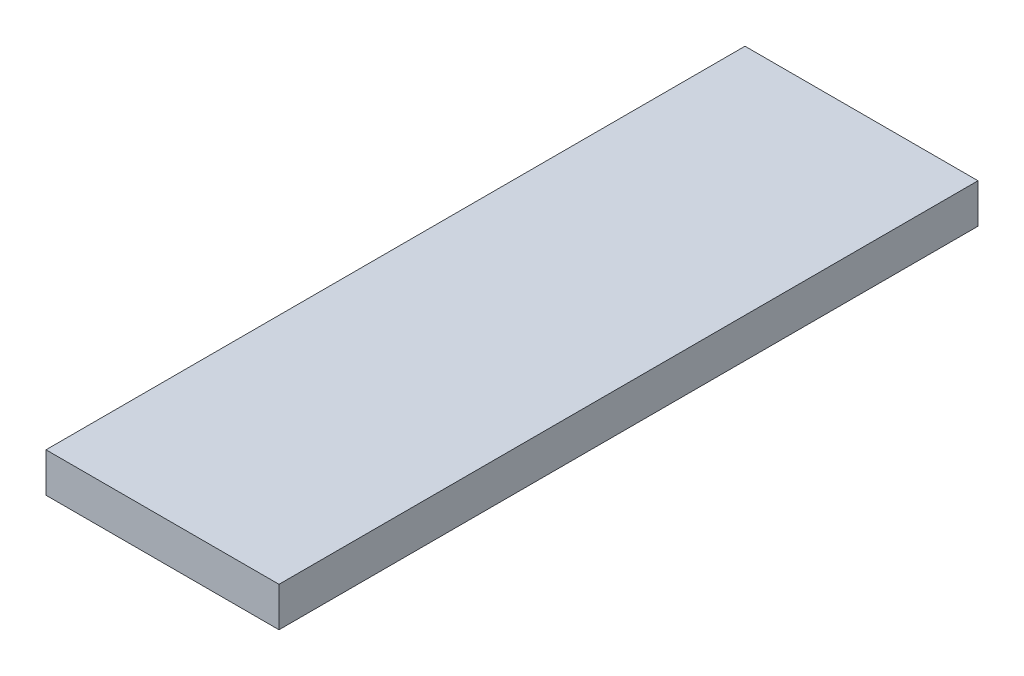
ISO-10303-21;
HEADER;
FILE_DESCRIPTION(('STEP AP214'),'2;1');
FILE_NAME('part.step','',(''),(''),'','','');
FILE_SCHEMA(('AUTOMOTIVE_DESIGN { 1 0 10303 214 1 1 1 1 }'));
ENDSEC;
DATA;
#1=APPLICATION_CONTEXT('core data for automotive mechanical design processes');
#2=APPLICATION_PROTOCOL_DEFINITION('international standard','automotive_design',2000,#1);
#3=PRODUCT_CONTEXT('',#1,'mechanical');
#4=PRODUCT('Part','Part','',(#3));
#5=PRODUCT_RELATED_PRODUCT_CATEGORY('part','',(#4));
#6=PRODUCT_DEFINITION_FORMATION('','',#4);
#7=PRODUCT_DEFINITION_CONTEXT('part definition',#1,'design');
#8=PRODUCT_DEFINITION('design','',#6,#7);
#9=PRODUCT_DEFINITION_SHAPE('','',#8);
#10=(LENGTH_UNIT() NAMED_UNIT(*) SI_UNIT(.MILLI.,.METRE.));
#11=(NAMED_UNIT(*) PLANE_ANGLE_UNIT() SI_UNIT($,.RADIAN.));
#12=(NAMED_UNIT(*) SI_UNIT($,.STERADIAN.) SOLID_ANGLE_UNIT());
#13=UNCERTAINTY_MEASURE_WITH_UNIT(LENGTH_MEASURE(1.E-05),#10,'distance_accuracy_value','');
#14=(GEOMETRIC_REPRESENTATION_CONTEXT(3) GLOBAL_UNCERTAINTY_ASSIGNED_CONTEXT((#13)) GLOBAL_UNIT_ASSIGNED_CONTEXT((#10,
#11,#12)) REPRESENTATION_CONTEXT('',''));
#15=CARTESIAN_POINT('',(0.,0.,0.));
#16=DIRECTION('',(0.,0.,1.));
#17=DIRECTION('',(1.,0.,0.));
#18=AXIS2_PLACEMENT_3D('',#15,#16,#17);
#19=CARTESIAN_POINT('',(0.,9.3,0.));
#20=DIRECTION('',(1.,0.,0.));
#21=DIRECTION('',(0.,0.,-1.));
#22=AXIS2_PLACEMENT_3D('',#19,#20,#21);
#23=PLANE('',#22);
#24=DIRECTION('',(0.,0.,1.));
#25=VECTOR('',#24,1.);
#26=CARTESIAN_POINT('',(0.,0.,0.));
#27=LINE('',#26,#25);
#28=CARTESIAN_POINT('',(0.,0.,-165.));
#29=VERTEX_POINT('',#28);
#30=CARTESIAN_POINT('',(0.,0.,0.));
#31=VERTEX_POINT('',#30);
#32=EDGE_CURVE('E95',#29,#31,#27,.T.);
#33=ORIENTED_EDGE('',*,*,#32,.T.);
#34=DIRECTION('',(0.,-1.,0.));
#35=VECTOR('',#34,1.);
#36=CARTESIAN_POINT('',(0.,9.3,0.));
#37=LINE('',#36,#35);
#38=CARTESIAN_POINT('',(0.,9.3,0.));
#39=VERTEX_POINT('',#38);
#40=EDGE_CURVE('E11',#39,#31,#37,.T.);
#41=ORIENTED_EDGE('',*,*,#40,.F.);
#42=DIRECTION('',(0.,0.,1.));
#43=VECTOR('',#42,1.);
#44=CARTESIAN_POINT('',(0.,9.3,0.));
#45=LINE('',#44,#43);
#46=CARTESIAN_POINT('',(0.,9.3,-165.));
#47=VERTEX_POINT('',#46);
#48=EDGE_CURVE('E83',#47,#39,#45,.T.);
#49=ORIENTED_EDGE('',*,*,#48,.F.);
#50=DIRECTION('',(0.,-1.,0.));
#51=VECTOR('',#50,1.);
#52=CARTESIAN_POINT('',(0.,9.3,-165.));
#53=LINE('',#52,#51);
#54=EDGE_CURVE('E91',#47,#29,#53,.T.);
#55=ORIENTED_EDGE('',*,*,#54,.T.);
#56=EDGE_LOOP('',(#33,#41,#49,#55));
#57=FACE_BOUND('',#56,.T.);
#58=ADVANCED_FACE('F32',(#57),#23,.F.);
#59=CARTESIAN_POINT('',(0.,9.3,0.));
#60=DIRECTION('',(0.,0.,-1.));
#61=DIRECTION('',(-1.,0.,0.));
#62=AXIS2_PLACEMENT_3D('',#59,#60,#61);
#63=PLANE('',#62);
#64=DIRECTION('',(1.,0.,0.));
#65=VECTOR('',#64,1.);
#66=CARTESIAN_POINT('',(0.,0.,0.));
#67=LINE('',#66,#65);
#68=CARTESIAN_POINT('',(55.,0.,0.));
#69=VERTEX_POINT('',#68);
#70=EDGE_CURVE('E87',#31,#69,#67,.T.);
#71=ORIENTED_EDGE('',*,*,#70,.T.);
#72=DIRECTION('',(0.,-1.,0.));
#73=VECTOR('',#72,1.);
#74=CARTESIAN_POINT('',(55.,9.3,0.));
#75=LINE('',#74,#73);
#76=CARTESIAN_POINT('',(55.,9.3,0.));
#77=VERTEX_POINT('',#76);
#78=EDGE_CURVE('E40',#77,#69,#75,.T.);
#79=ORIENTED_EDGE('',*,*,#78,.F.);
#80=DIRECTION('',(1.,0.,0.));
#81=VECTOR('',#80,1.);
#82=CARTESIAN_POINT('',(0.,9.3,0.));
#83=LINE('',#82,#81);
#84=EDGE_CURVE('E78',#39,#77,#83,.T.);
#85=ORIENTED_EDGE('',*,*,#84,.F.);
#86=ORIENTED_EDGE('',*,*,#40,.T.);
#87=EDGE_LOOP('',(#71,#79,#85,#86));
#88=FACE_BOUND('',#87,.T.);
#89=ADVANCED_FACE('F86',(#88),#63,.F.);
#90=CARTESIAN_POINT('',(55.,9.3,0.));
#91=DIRECTION('',(-1.,0.,0.));
#92=DIRECTION('',(0.,0.,1.));
#93=AXIS2_PLACEMENT_3D('',#90,#91,#92);
#94=PLANE('',#93);
#95=DIRECTION('',(0.,0.,-1.));
#96=VECTOR('',#95,1.);
#97=CARTESIAN_POINT('',(55.,0.,0.));
#98=LINE('',#97,#96);
#99=CARTESIAN_POINT('',(55.,0.,-165.));
#100=VERTEX_POINT('',#99);
#101=EDGE_CURVE('E65',#69,#100,#98,.T.);
#102=ORIENTED_EDGE('',*,*,#101,.T.);
#103=DIRECTION('',(0.,-1.,0.));
#104=VECTOR('',#103,1.);
#105=CARTESIAN_POINT('',(55.,9.3,-165.));
#106=LINE('',#105,#104);
#107=CARTESIAN_POINT('',(55.,9.3,-165.));
#108=VERTEX_POINT('',#107);
#109=EDGE_CURVE('E88',#108,#100,#106,.T.);
#110=ORIENTED_EDGE('',*,*,#109,.F.);
#111=DIRECTION('',(0.,0.,-1.));
#112=VECTOR('',#111,1.);
#113=CARTESIAN_POINT('',(55.,9.3,0.));
#114=LINE('',#113,#112);
#115=EDGE_CURVE('E81',#77,#108,#114,.T.);
#116=ORIENTED_EDGE('',*,*,#115,.F.);
#117=ORIENTED_EDGE('',*,*,#78,.T.);
#118=EDGE_LOOP('',(#102,#110,#116,#117));
#119=FACE_BOUND('',#118,.T.);
#120=ADVANCED_FACE('F89',(#119),#94,.F.);
#121=CARTESIAN_POINT('',(0.,9.3,-165.));
#122=DIRECTION('',(0.,0.,1.));
#123=DIRECTION('',(1.,0.,0.));
#124=AXIS2_PLACEMENT_3D('',#121,#122,#123);
#125=PLANE('',#124);
#126=DIRECTION('',(-1.,0.,0.));
#127=VECTOR('',#126,1.);
#128=CARTESIAN_POINT('',(0.,0.,-165.));
#129=LINE('',#128,#127);
#130=EDGE_CURVE('E71',#100,#29,#129,.T.);
#131=ORIENTED_EDGE('',*,*,#130,.T.);
#132=ORIENTED_EDGE('',*,*,#54,.F.);
#133=DIRECTION('',(-1.,0.,0.));
#134=VECTOR('',#133,1.);
#135=CARTESIAN_POINT('',(0.,9.3,-165.));
#136=LINE('',#135,#134);
#137=EDGE_CURVE('E48',#108,#47,#136,.T.);
#138=ORIENTED_EDGE('',*,*,#137,.F.);
#139=ORIENTED_EDGE('',*,*,#109,.T.);
#140=EDGE_LOOP('',(#131,#132,#138,#139));
#141=FACE_BOUND('',#140,.T.);
#142=ADVANCED_FACE('F102',(#141),#125,.F.);
#143=CARTESIAN_POINT('',(0.,9.3,0.));
#144=DIRECTION('',(0.,-1.,0.));
#145=DIRECTION('',(0.,0.,-1.));
#146=AXIS2_PLACEMENT_3D('',#143,#144,#145);
#147=PLANE('',#146);
#148=ORIENTED_EDGE('',*,*,#48,.T.);
#149=ORIENTED_EDGE('',*,*,#84,.T.);
#150=ORIENTED_EDGE('',*,*,#115,.T.);
#151=ORIENTED_EDGE('',*,*,#137,.T.);
#152=EDGE_LOOP('',(#148,#149,#150,#151));
#153=FACE_BOUND('',#152,.T.);
#154=ADVANCED_FACE('F79',(#153),#147,.F.);
#155=CARTESIAN_POINT('',(0.,0.,0.));
#156=DIRECTION('',(0.,-1.,0.));
#157=DIRECTION('',(0.,0.,-1.));
#158=AXIS2_PLACEMENT_3D('',#155,#156,#157);
#159=PLANE('',#158);
#160=ORIENTED_EDGE('',*,*,#32,.F.);
#161=ORIENTED_EDGE('',*,*,#130,.F.);
#162=ORIENTED_EDGE('',*,*,#101,.F.);
#163=ORIENTED_EDGE('',*,*,#70,.F.);
#164=EDGE_LOOP('',(#160,#161,#162,#163));
#165=FACE_BOUND('',#164,.T.);
#166=ADVANCED_FACE('F105',(#165),#159,.T.);
#167=CLOSED_SHELL('',(#58,#89,#120,#142,#154,#166));
#168=MANIFOLD_SOLID_BREP('B2',#167);
#169=ADVANCED_BREP_SHAPE_REPRESENTATION('',(#18,#168),#14);
#170=SHAPE_DEFINITION_REPRESENTATION(#9,#169);
ENDSEC;
END-ISO-10303-21;
